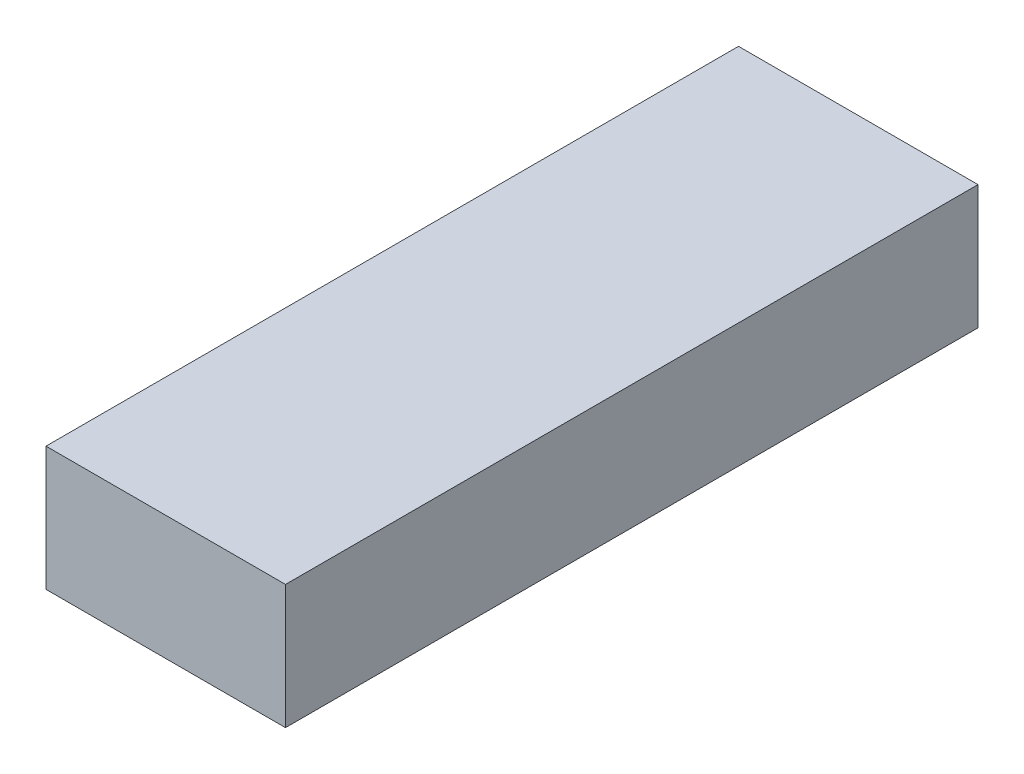
ISO-10303-21;
HEADER;
FILE_DESCRIPTION(('STEP AP214'),'2;1');
FILE_NAME('part.step','',(''),(''),'','','');
FILE_SCHEMA(('AUTOMOTIVE_DESIGN { 1 0 10303 214 1 1 1 1 }'));
ENDSEC;
DATA;
#1=APPLICATION_CONTEXT('core data for automotive mechanical design processes');
#2=APPLICATION_PROTOCOL_DEFINITION('international standard','automotive_design',2000,#1);
#3=PRODUCT_CONTEXT('',#1,'mechanical');
#4=PRODUCT('Part','Part','',(#3));
#5=PRODUCT_RELATED_PRODUCT_CATEGORY('part','',(#4));
#6=PRODUCT_DEFINITION_FORMATION('','',#4);
#7=PRODUCT_DEFINITION_CONTEXT('part definition',#1,'design');
#8=PRODUCT_DEFINITION('design','',#6,#7);
#9=PRODUCT_DEFINITION_SHAPE('','',#8);
#10=(LENGTH_UNIT() NAMED_UNIT(*) SI_UNIT(.MILLI.,.METRE.));
#11=(NAMED_UNIT(*) PLANE_ANGLE_UNIT() SI_UNIT($,.RADIAN.));
#12=(NAMED_UNIT(*) SI_UNIT($,.STERADIAN.) SOLID_ANGLE_UNIT());
#13=UNCERTAINTY_MEASURE_WITH_UNIT(LENGTH_MEASURE(1.E-05),#10,'distance_accuracy_value','');
#14=(GEOMETRIC_REPRESENTATION_CONTEXT(3) GLOBAL_UNCERTAINTY_ASSIGNED_CONTEXT((#13)) GLOBAL_UNIT_ASSIGNED_CONTEXT((#10,
#11,#12)) REPRESENTATION_CONTEXT('',''));
#15=CARTESIAN_POINT('',(0.,0.,0.));
#16=DIRECTION('',(0.,0.,1.));
#17=DIRECTION('',(1.,0.,0.));
#18=AXIS2_PLACEMENT_3D('',#15,#16,#17);
#19=CARTESIAN_POINT('',(16.6,-8.6,96.));
#20=DIRECTION('',(-1.,0.,0.));
#21=DIRECTION('',(0.,0.,1.));
#22=AXIS2_PLACEMENT_3D('',#19,#20,#21);
#23=PLANE('',#22);
#24=DIRECTION('',(0.,1.,0.));
#25=VECTOR('',#24,1.);
#26=CARTESIAN_POINT('',(16.6,-8.6,0.));
#27=LINE('',#26,#25);
#28=CARTESIAN_POINT('',(16.6,-8.6,0.));
#29=VERTEX_POINT('',#28);
#30=CARTESIAN_POINT('',(16.6,8.6,0.));
#31=VERTEX_POINT('',#30);
#32=EDGE_CURVE('E111',#29,#31,#27,.T.);
#33=ORIENTED_EDGE('',*,*,#32,.T.);
#34=DIRECTION('',(0.,0.,-1.));
#35=VECTOR('',#34,1.);
#36=CARTESIAN_POINT('',(16.6,8.6,96.));
#37=LINE('',#36,#35);
#38=CARTESIAN_POINT('',(16.6,8.6,96.));
#39=VERTEX_POINT('',#38);
#40=EDGE_CURVE('E11',#39,#31,#37,.T.);
#41=ORIENTED_EDGE('',*,*,#40,.F.);
#42=DIRECTION('',(0.,1.,0.));
#43=VECTOR('',#42,1.);
#44=CARTESIAN_POINT('',(16.6,-8.6,96.));
#45=LINE('',#44,#43);
#46=CARTESIAN_POINT('',(16.6,-8.6,96.));
#47=VERTEX_POINT('',#46);
#48=EDGE_CURVE('E100',#47,#39,#45,.T.);
#49=ORIENTED_EDGE('',*,*,#48,.F.);
#50=DIRECTION('',(0.,0.,-1.));
#51=VECTOR('',#50,1.);
#52=CARTESIAN_POINT('',(16.6,-8.6,96.));
#53=LINE('',#52,#51);
#54=EDGE_CURVE('E108',#47,#29,#53,.T.);
#55=ORIENTED_EDGE('',*,*,#54,.T.);
#56=EDGE_LOOP('',(#33,#41,#49,#55));
#57=FACE_BOUND('',#56,.T.);
#58=ADVANCED_FACE('F44',(#57),#23,.F.);
#59=CARTESIAN_POINT('',(-16.6,8.6,96.));
#60=DIRECTION('',(0.,-1.,0.));
#61=DIRECTION('',(0.,0.,-1.));
#62=AXIS2_PLACEMENT_3D('',#59,#60,#61);
#63=PLANE('',#62);
#64=DIRECTION('',(-1.,0.,0.));
#65=VECTOR('',#64,1.);
#66=CARTESIAN_POINT('',(-16.6,8.6,0.));
#67=LINE('',#66,#65);
#68=CARTESIAN_POINT('',(-16.6,8.6,0.));
#69=VERTEX_POINT('',#68);
#70=EDGE_CURVE('E105',#31,#69,#67,.T.);
#71=ORIENTED_EDGE('',*,*,#70,.T.);
#72=DIRECTION('',(0.,0.,-1.));
#73=VECTOR('',#72,1.);
#74=CARTESIAN_POINT('',(-16.6,8.6,96.));
#75=LINE('',#74,#73);
#76=CARTESIAN_POINT('',(-16.6,8.6,96.));
#77=VERTEX_POINT('',#76);
#78=EDGE_CURVE('E53',#77,#69,#75,.T.);
#79=ORIENTED_EDGE('',*,*,#78,.F.);
#80=DIRECTION('',(-1.,0.,0.));
#81=VECTOR('',#80,1.);
#82=CARTESIAN_POINT('',(-16.6,8.6,96.));
#83=LINE('',#82,#81);
#84=EDGE_CURVE('E95',#39,#77,#83,.T.);
#85=ORIENTED_EDGE('',*,*,#84,.F.);
#86=ORIENTED_EDGE('',*,*,#40,.T.);
#87=EDGE_LOOP('',(#71,#79,#85,#86));
#88=FACE_BOUND('',#87,.T.);
#89=ADVANCED_FACE('F102',(#88),#63,.F.);
#90=CARTESIAN_POINT('',(-16.6,-8.6,96.));
#91=DIRECTION('',(1.,0.,0.));
#92=DIRECTION('',(0.,0.,-1.));
#93=AXIS2_PLACEMENT_3D('',#90,#91,#92);
#94=PLANE('',#93);
#95=DIRECTION('',(0.,-1.,0.));
#96=VECTOR('',#95,1.);
#97=CARTESIAN_POINT('',(-16.6,-8.6,0.));
#98=LINE('',#97,#96);
#99=CARTESIAN_POINT('',(-16.6,-8.6,0.));
#100=VERTEX_POINT('',#99);
#101=EDGE_CURVE('E80',#69,#100,#98,.T.);
#102=ORIENTED_EDGE('',*,*,#101,.T.);
#103=DIRECTION('',(0.,0.,-1.));
#104=VECTOR('',#103,1.);
#105=CARTESIAN_POINT('',(-16.6,-8.6,96.));
#106=LINE('',#105,#104);
#107=CARTESIAN_POINT('',(-16.6,-8.6,96.));
#108=VERTEX_POINT('',#107);
#109=EDGE_CURVE('E101',#108,#100,#106,.T.);
#110=ORIENTED_EDGE('',*,*,#109,.F.);
#111=DIRECTION('',(0.,-1.,0.));
#112=VECTOR('',#111,1.);
#113=CARTESIAN_POINT('',(-16.6,-8.6,96.));
#114=LINE('',#113,#112);
#115=EDGE_CURVE('E94',#77,#108,#114,.T.);
#116=ORIENTED_EDGE('',*,*,#115,.F.);
#117=ORIENTED_EDGE('',*,*,#78,.T.);
#118=EDGE_LOOP('',(#102,#110,#116,#117));
#119=FACE_BOUND('',#118,.T.);
#120=ADVANCED_FACE('F103',(#119),#94,.F.);
#121=CARTESIAN_POINT('',(-16.6,-8.6,96.));
#122=DIRECTION('',(0.,1.,0.));
#123=DIRECTION('',(0.,0.,1.));
#124=AXIS2_PLACEMENT_3D('',#121,#122,#123);
#125=PLANE('',#124);
#126=DIRECTION('',(1.,0.,0.));
#127=VECTOR('',#126,1.);
#128=CARTESIAN_POINT('',(-16.6,-8.6,0.));
#129=LINE('',#128,#127);
#130=EDGE_CURVE('E82',#100,#29,#129,.T.);
#131=ORIENTED_EDGE('',*,*,#130,.T.);
#132=ORIENTED_EDGE('',*,*,#54,.F.);
#133=DIRECTION('',(1.,0.,0.));
#134=VECTOR('',#133,1.);
#135=CARTESIAN_POINT('',(-16.6,-8.6,96.));
#136=LINE('',#135,#134);
#137=EDGE_CURVE('E62',#108,#47,#136,.T.);
#138=ORIENTED_EDGE('',*,*,#137,.F.);
#139=ORIENTED_EDGE('',*,*,#109,.T.);
#140=EDGE_LOOP('',(#131,#132,#138,#139));
#141=FACE_BOUND('',#140,.T.);
#142=ADVANCED_FACE('F128',(#141),#125,.F.);
#143=CARTESIAN_POINT('',(0.,0.,96.));
#144=DIRECTION('',(0.,0.,-1.));
#145=DIRECTION('',(-1.,0.,0.));
#146=AXIS2_PLACEMENT_3D('',#143,#144,#145);
#147=PLANE('',#146);
#148=ORIENTED_EDGE('',*,*,#48,.T.);
#149=ORIENTED_EDGE('',*,*,#84,.T.);
#150=ORIENTED_EDGE('',*,*,#115,.T.);
#151=ORIENTED_EDGE('',*,*,#137,.T.);
#152=EDGE_LOOP('',(#148,#149,#150,#151));
#153=FACE_BOUND('',#152,.T.);
#154=ADVANCED_FACE('F93',(#153),#147,.F.);
#155=CARTESIAN_POINT('',(0.,0.,0.));
#156=DIRECTION('',(0.,0.,-1.));
#157=DIRECTION('',(-1.,0.,0.));
#158=AXIS2_PLACEMENT_3D('',#155,#156,#157);
#159=PLANE('',#158);
#160=ORIENTED_EDGE('',*,*,#32,.F.);
#161=ORIENTED_EDGE('',*,*,#130,.F.);
#162=ORIENTED_EDGE('',*,*,#101,.F.);
#163=ORIENTED_EDGE('',*,*,#70,.F.);
#164=EDGE_LOOP('',(#160,#161,#162,#163));
#165=FACE_BOUND('',#164,.T.);
#166=ADVANCED_FACE('F129',(#165),#159,.T.);
#167=CLOSED_SHELL('',(#58,#89,#120,#142,#154,#166));
#168=MANIFOLD_SOLID_BREP('B2',#167);
#169=ADVANCED_BREP_SHAPE_REPRESENTATION('',(#18,#168),#14);
#170=SHAPE_DEFINITION_REPRESENTATION(#9,#169);
ENDSEC;
END-ISO-10303-21;
